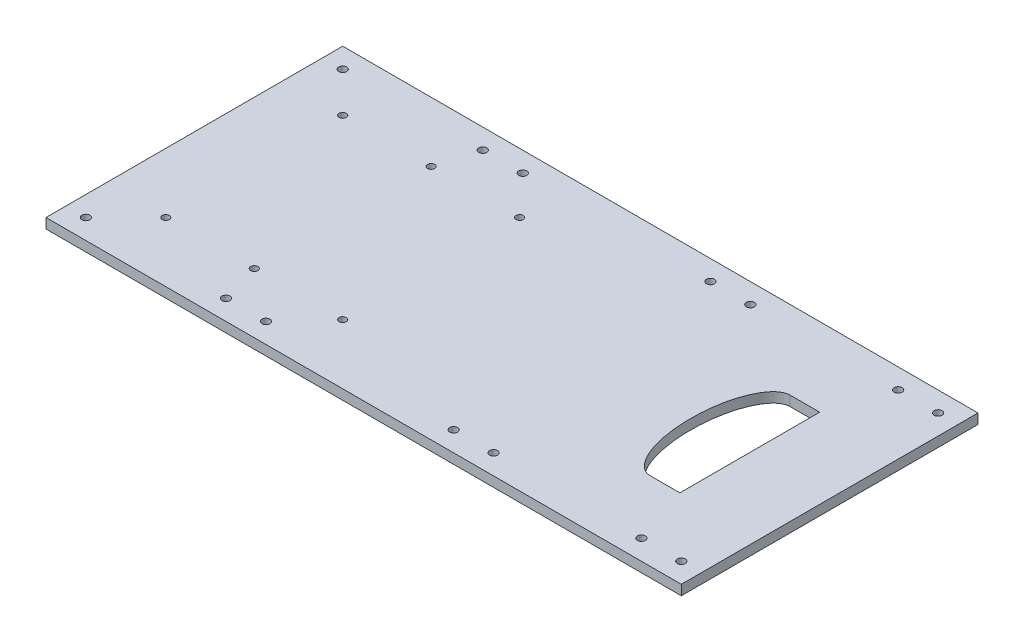
ISO-10303-21;
HEADER;
FILE_DESCRIPTION(('STEP AP214'),'2;1');
FILE_NAME('part.step','',(''),(''),'','','');
FILE_SCHEMA(('AUTOMOTIVE_DESIGN { 1 0 10303 214 1 1 1 1 }'));
ENDSEC;
DATA;
#1=APPLICATION_CONTEXT('core data for automotive mechanical design processes');
#2=APPLICATION_PROTOCOL_DEFINITION('international standard','automotive_design',2000,#1);
#3=PRODUCT_CONTEXT('',#1,'mechanical');
#4=PRODUCT('Part','Part','',(#3));
#5=PRODUCT_RELATED_PRODUCT_CATEGORY('part','',(#4));
#6=PRODUCT_DEFINITION_FORMATION('','',#4);
#7=PRODUCT_DEFINITION_CONTEXT('part definition',#1,'design');
#8=PRODUCT_DEFINITION('design','',#6,#7);
#9=PRODUCT_DEFINITION_SHAPE('','',#8);
#10=(LENGTH_UNIT() NAMED_UNIT(*) SI_UNIT(.MILLI.,.METRE.));
#11=(NAMED_UNIT(*) PLANE_ANGLE_UNIT() SI_UNIT($,.RADIAN.));
#12=(NAMED_UNIT(*) SI_UNIT($,.STERADIAN.) SOLID_ANGLE_UNIT());
#13=UNCERTAINTY_MEASURE_WITH_UNIT(LENGTH_MEASURE(1.E-05),#10,'distance_accuracy_value','');
#14=(GEOMETRIC_REPRESENTATION_CONTEXT(3) GLOBAL_UNCERTAINTY_ASSIGNED_CONTEXT((#13)) GLOBAL_UNIT_ASSIGNED_CONTEXT((#10,
#11,#12)) REPRESENTATION_CONTEXT('',''));
#15=CARTESIAN_POINT('',(0.,0.,0.));
#16=DIRECTION('',(0.,0.,1.));
#17=DIRECTION('',(1.,0.,0.));
#18=AXIS2_PLACEMENT_3D('',#15,#16,#17);
#19=CARTESIAN_POINT('',(286.384454851621,5.,1.06989237388449E-13));
#20=DIRECTION('',(1.,0.,0.));
#21=DIRECTION('',(0.,0.,-1.));
#22=AXIS2_PLACEMENT_3D('',#19,#20,#21);
#23=PLANE('',#22);
#24=DIRECTION('',(0.,0.,1.));
#25=VECTOR('',#24,1.);
#26=CARTESIAN_POINT('',(286.384454851621,0.,1.06989237388449E-13));
#27=LINE('',#26,#25);
#28=CARTESIAN_POINT('',(286.384454851621,0.,2.88781780476488));
#29=VERTEX_POINT('',#28);
#30=CARTESIAN_POINT('',(286.384454851621,0.,151.477817804765));
#31=VERTEX_POINT('',#30);
#32=EDGE_CURVE('E270',#29,#31,#27,.T.);
#33=ORIENTED_EDGE('',*,*,#32,.F.);
#34=DIRECTION('',(0.,-1.,0.));
#35=VECTOR('',#34,1.);
#36=CARTESIAN_POINT('',(286.384454851621,5.,2.88781780476488));
#37=LINE('',#36,#35);
#38=CARTESIAN_POINT('',(286.384454851621,5.,2.88781780476488));
#39=VERTEX_POINT('',#38);
#40=EDGE_CURVE('E12',#39,#29,#37,.T.);
#41=ORIENTED_EDGE('',*,*,#40,.F.);
#42=DIRECTION('',(0.,0.,1.));
#43=VECTOR('',#42,1.);
#44=CARTESIAN_POINT('',(286.384454851621,5.,1.06989237388449E-13));
#45=LINE('',#44,#43);
#46=CARTESIAN_POINT('',(286.384454851621,5.,151.477817804765));
#47=VERTEX_POINT('',#46);
#48=EDGE_CURVE('E280',#39,#47,#45,.T.);
#49=ORIENTED_EDGE('',*,*,#48,.T.);
#50=DIRECTION('',(0.,-1.,0.));
#51=VECTOR('',#50,1.);
#52=CARTESIAN_POINT('',(286.384454851621,5.,151.477817804765));
#53=LINE('',#52,#51);
#54=EDGE_CURVE('E281',#47,#31,#53,.T.);
#55=ORIENTED_EDGE('',*,*,#54,.T.);
#56=EDGE_LOOP('',(#33,#41,#49,#55));
#57=FACE_BOUND('',#56,.T.);
#58=ADVANCED_FACE('F58',(#57),#23,.T.);
#59=CARTESIAN_POINT('',(0.,5.,2.88781780476488));
#60=DIRECTION('',(0.,0.,-1.));
#61=DIRECTION('',(-1.,0.,0.));
#62=AXIS2_PLACEMENT_3D('',#59,#60,#61);
#63=PLANE('',#62);
#64=DIRECTION('',(1.,0.,0.));
#65=VECTOR('',#64,1.);
#66=CARTESIAN_POINT('',(0.,0.,2.88781780476488));
#67=LINE('',#66,#65);
#68=CARTESIAN_POINT('',(-31.7655451483791,0.,2.88781780476488));
#69=VERTEX_POINT('',#68);
#70=EDGE_CURVE('E262',#69,#29,#67,.T.);
#71=ORIENTED_EDGE('',*,*,#70,.F.);
#72=DIRECTION('',(0.,-1.,0.));
#73=VECTOR('',#72,1.);
#74=CARTESIAN_POINT('',(-31.7655451483791,5.,2.88781780476488));
#75=LINE('',#74,#73);
#76=CARTESIAN_POINT('',(-31.7655451483791,5.,2.88781780476488));
#77=VERTEX_POINT('',#76);
#78=EDGE_CURVE('E65',#77,#69,#75,.T.);
#79=ORIENTED_EDGE('',*,*,#78,.F.);
#80=DIRECTION('',(1.,0.,0.));
#81=VECTOR('',#80,1.);
#82=CARTESIAN_POINT('',(0.,5.,2.88781780476488));
#83=LINE('',#82,#81);
#84=EDGE_CURVE('E295',#77,#39,#83,.T.);
#85=ORIENTED_EDGE('',*,*,#84,.T.);
#86=ORIENTED_EDGE('',*,*,#40,.T.);
#87=EDGE_LOOP('',(#71,#79,#85,#86));
#88=FACE_BOUND('',#87,.T.);
#89=ADVANCED_FACE('F252',(#88),#63,.T.);
#90=CARTESIAN_POINT('',(-31.7655451483791,5.,0.));
#91=DIRECTION('',(1.,0.,0.));
#92=DIRECTION('',(0.,0.,-1.));
#93=AXIS2_PLACEMENT_3D('',#90,#91,#92);
#94=PLANE('',#93);
#95=DIRECTION('',(0.,0.,1.));
#96=VECTOR('',#95,1.);
#97=CARTESIAN_POINT('',(-31.7655451483791,0.,0.));
#98=LINE('',#97,#96);
#99=CARTESIAN_POINT('',(-31.7655451483791,0.,151.477817804765));
#100=VERTEX_POINT('',#99);
#101=EDGE_CURVE('E269',#69,#100,#98,.T.);
#102=ORIENTED_EDGE('',*,*,#101,.T.);
#103=DIRECTION('',(0.,-1.,0.));
#104=VECTOR('',#103,1.);
#105=CARTESIAN_POINT('',(-31.7655451483791,5.,151.477817804765));
#106=LINE('',#105,#104);
#107=CARTESIAN_POINT('',(-31.7655451483791,5.,151.477817804765));
#108=VERTEX_POINT('',#107);
#109=EDGE_CURVE('E283',#108,#100,#106,.T.);
#110=ORIENTED_EDGE('',*,*,#109,.F.);
#111=DIRECTION('',(0.,0.,1.));
#112=VECTOR('',#111,1.);
#113=CARTESIAN_POINT('',(-31.7655451483791,5.,0.));
#114=LINE('',#113,#112);
#115=EDGE_CURVE('E287',#77,#108,#114,.T.);
#116=ORIENTED_EDGE('',*,*,#115,.F.);
#117=ORIENTED_EDGE('',*,*,#78,.T.);
#118=EDGE_LOOP('',(#102,#110,#116,#117));
#119=FACE_BOUND('',#118,.T.);
#120=ADVANCED_FACE('F249',(#119),#94,.F.);
#121=CARTESIAN_POINT('',(0.,5.,151.477817804765));
#122=DIRECTION('',(0.,0.,-1.));
#123=DIRECTION('',(-1.,0.,0.));
#124=AXIS2_PLACEMENT_3D('',#121,#122,#123);
#125=PLANE('',#124);
#126=DIRECTION('',(1.,0.,0.));
#127=VECTOR('',#126,1.);
#128=CARTESIAN_POINT('',(0.,0.,151.477817804765));
#129=LINE('',#128,#127);
#130=EDGE_CURVE('E272',#100,#31,#129,.T.);
#131=ORIENTED_EDGE('',*,*,#130,.T.);
#132=ORIENTED_EDGE('',*,*,#54,.F.);
#133=DIRECTION('',(1.,0.,0.));
#134=VECTOR('',#133,1.);
#135=CARTESIAN_POINT('',(0.,5.,151.477817804765));
#136=LINE('',#135,#134);
#137=EDGE_CURVE('E284',#108,#47,#136,.T.);
#138=ORIENTED_EDGE('',*,*,#137,.F.);
#139=ORIENTED_EDGE('',*,*,#109,.T.);
#140=EDGE_LOOP('',(#131,#132,#138,#139));
#141=FACE_BOUND('',#140,.T.);
#142=ADVANCED_FACE('F243',(#141),#125,.F.);
#143=CARTESIAN_POINT('',(0.,5.,0.));
#144=DIRECTION('',(0.,1.,0.));
#145=DIRECTION('',(0.,0.,1.));
#146=AXIS2_PLACEMENT_3D('',#143,#144,#145);
#147=PLANE('',#146);
#148=DIRECTION('',(1.,0.,0.));
#149=VECTOR('',#148,1.);
#150=CARTESIAN_POINT('',(0.,5.,112.182817804765));
#151=LINE('',#150,#149);
#152=CARTESIAN_POINT('',(231.591274663147,5.,112.182817804765));
#153=VERTEX_POINT('',#152);
#154=CARTESIAN_POINT('',(246.384454851621,5.,112.182817804765));
#155=VERTEX_POINT('',#154);
#156=EDGE_CURVE('E124',#153,#155,#151,.T.);
#157=ORIENTED_EDGE('',*,*,#156,.F.);
#158=CARTESIAN_POINT('',(231.591274663147,5.,77.1828178047649));
#159=DIRECTION('',(0.,-1.,0.));
#160=DIRECTION('',(0.,0.,1.));
#161=AXIS2_PLACEMENT_3D('',#158,#159,#160);
#162=ELLIPSE('',#161,35.,14.7931801884737);
#163=CARTESIAN_POINT('',(231.591274663147,5.,42.1828178047649));
#164=VERTEX_POINT('',#163);
#165=EDGE_CURVE('E144',#164,#153,#162,.F.);
#166=ORIENTED_EDGE('',*,*,#165,.F.);
#167=DIRECTION('',(1.,0.,0.));
#168=VECTOR('',#167,1.);
#169=CARTESIAN_POINT('',(0.,5.,42.1828178047648));
#170=LINE('',#169,#168);
#171=CARTESIAN_POINT('',(246.384454851621,5.,42.1828178047649));
#172=VERTEX_POINT('',#171);
#173=EDGE_CURVE('E422',#164,#172,#170,.T.);
#174=ORIENTED_EDGE('',*,*,#173,.T.);
#175=DIRECTION('',(0.,0.,-1.));
#176=VECTOR('',#175,1.);
#177=CARTESIAN_POINT('',(246.384454851621,5.,0.));
#178=LINE('',#177,#176);
#179=EDGE_CURVE('E420',#155,#172,#178,.T.);
#180=ORIENTED_EDGE('',*,*,#179,.F.);
#181=EDGE_LOOP('',(#157,#166,#174,#180));
#182=FACE_BOUND('',#181,.T.);
#183=CARTESIAN_POINT('',(256.384454851621,5.,141.477817804765));
#184=DIRECTION('',(0.,1.,0.));
#185=DIRECTION('',(0.,0.,1.));
#186=AXIS2_PLACEMENT_3D('',#183,#184,#185);
#187=CIRCLE('',#186,2.);
#188=CARTESIAN_POINT('',(256.384454851621,5.,143.477817804765));
#189=VERTEX_POINT('',#188);
#190=EDGE_CURVE('E407',#189,#189,#187,.T.);
#191=ORIENTED_EDGE('',*,*,#190,.F.);
#192=EDGE_LOOP('',(#191));
#193=FACE_BOUND('',#192,.T.);
#194=CARTESIAN_POINT('',(256.384454851621,5.,12.8878178047649));
#195=DIRECTION('',(0.,1.,0.));
#196=DIRECTION('',(0.,0.,1.));
#197=AXIS2_PLACEMENT_3D('',#194,#195,#196);
#198=CIRCLE('',#197,2.);
#199=CARTESIAN_POINT('',(256.384454851621,5.,14.8878178047649));
#200=VERTEX_POINT('',#199);
#201=EDGE_CURVE('E410',#200,#200,#198,.T.);
#202=ORIENTED_EDGE('',*,*,#201,.F.);
#203=EDGE_LOOP('',(#202));
#204=FACE_BOUND('',#203,.T.);
#205=CARTESIAN_POINT('',(48.3844548516209,5.,141.477817804765));
#206=DIRECTION('',(0.,1.,0.));
#207=DIRECTION('',(0.,0.,1.));
#208=AXIS2_PLACEMENT_3D('',#205,#206,#207);
#209=CIRCLE('',#208,2.);
#210=CARTESIAN_POINT('',(48.3844548516209,5.,143.477817804765));
#211=VERTEX_POINT('',#210);
#212=EDGE_CURVE('E357',#211,#211,#209,.T.);
#213=ORIENTED_EDGE('',*,*,#212,.F.);
#214=EDGE_LOOP('',(#213));
#215=FACE_BOUND('',#214,.T.);
#216=CARTESIAN_POINT('',(162.384454851621,5.,141.477817804765));
#217=DIRECTION('',(0.,1.,0.));
#218=DIRECTION('',(0.,0.,1.));
#219=AXIS2_PLACEMENT_3D('',#216,#217,#218);
#220=CIRCLE('',#219,2.);
#221=CARTESIAN_POINT('',(162.384454851621,5.,143.477817804765));
#222=VERTEX_POINT('',#221);
#223=EDGE_CURVE('E362',#222,#222,#220,.T.);
#224=ORIENTED_EDGE('',*,*,#223,.F.);
#225=EDGE_LOOP('',(#224));
#226=FACE_BOUND('',#225,.T.);
#227=CARTESIAN_POINT('',(182.384454851621,5.,141.477817804765));
#228=DIRECTION('',(0.,1.,0.));
#229=DIRECTION('',(0.,0.,1.));
#230=AXIS2_PLACEMENT_3D('',#227,#228,#229);
#231=CIRCLE('',#230,2.);
#232=CARTESIAN_POINT('',(182.384454851621,5.,143.477817804765));
#233=VERTEX_POINT('',#232);
#234=EDGE_CURVE('E365',#233,#233,#231,.T.);
#235=ORIENTED_EDGE('',*,*,#234,.F.);
#236=EDGE_LOOP('',(#235));
#237=FACE_BOUND('',#236,.T.);
#238=CARTESIAN_POINT('',(182.384454851621,5.,12.8878178047649));
#239=DIRECTION('',(0.,1.,0.));
#240=DIRECTION('',(0.,0.,1.));
#241=AXIS2_PLACEMENT_3D('',#238,#239,#240);
#242=CIRCLE('',#241,2.);
#243=CARTESIAN_POINT('',(182.384454851621,5.,14.8878178047649));
#244=VERTEX_POINT('',#243);
#245=EDGE_CURVE('E368',#244,#244,#242,.T.);
#246=ORIENTED_EDGE('',*,*,#245,.F.);
#247=EDGE_LOOP('',(#246));
#248=FACE_BOUND('',#247,.T.);
#249=CARTESIAN_POINT('',(68.384454851621,5.,12.8878178047649));
#250=DIRECTION('',(0.,1.,0.));
#251=DIRECTION('',(0.,0.,1.));
#252=AXIS2_PLACEMENT_3D('',#249,#250,#251);
#253=CIRCLE('',#252,2.);
#254=CARTESIAN_POINT('',(68.384454851621,5.,14.8878178047649));
#255=VERTEX_POINT('',#254);
#256=EDGE_CURVE('E371',#255,#255,#253,.T.);
#257=ORIENTED_EDGE('',*,*,#256,.F.);
#258=EDGE_LOOP('',(#257));
#259=FACE_BOUND('',#258,.T.);
#260=CARTESIAN_POINT('',(48.3844548516209,5.,12.8878178047649));
#261=DIRECTION('',(0.,1.,0.));
#262=DIRECTION('',(0.,0.,1.));
#263=AXIS2_PLACEMENT_3D('',#260,#261,#262);
#264=CIRCLE('',#263,2.);
#265=CARTESIAN_POINT('',(48.3844548516209,5.,14.8878178047649));
#266=VERTEX_POINT('',#265);
#267=EDGE_CURVE('E374',#266,#266,#264,.T.);
#268=ORIENTED_EDGE('',*,*,#267,.F.);
#269=EDGE_LOOP('',(#268));
#270=FACE_BOUND('',#269,.T.);
#271=CARTESIAN_POINT('',(162.384454851621,5.,12.8878178047649));
#272=DIRECTION('',(0.,1.,0.));
#273=DIRECTION('',(0.,0.,1.));
#274=AXIS2_PLACEMENT_3D('',#271,#272,#273);
#275=CIRCLE('',#274,2.);
#276=CARTESIAN_POINT('',(162.384454851621,5.,14.8878178047649));
#277=VERTEX_POINT('',#276);
#278=EDGE_CURVE('E377',#277,#277,#275,.T.);
#279=ORIENTED_EDGE('',*,*,#278,.F.);
#280=EDGE_LOOP('',(#279));
#281=FACE_BOUND('',#280,.T.);
#282=CARTESIAN_POINT('',(68.384454851621,5.,141.477817804765));
#283=DIRECTION('',(0.,1.,0.));
#284=DIRECTION('',(0.,0.,1.));
#285=AXIS2_PLACEMENT_3D('',#282,#283,#284);
#286=CIRCLE('',#285,2.);
#287=CARTESIAN_POINT('',(68.384454851621,5.,143.477817804765));
#288=VERTEX_POINT('',#287);
#289=EDGE_CURVE('E380',#288,#288,#286,.T.);
#290=ORIENTED_EDGE('',*,*,#289,.F.);
#291=EDGE_LOOP('',(#290));
#292=FACE_BOUND('',#291,.T.);
#293=CARTESIAN_POINT('',(86.8244548516209,5.,121.477817804765));
#294=DIRECTION('',(0.,-1.,0.));
#295=DIRECTION('',(0.,0.,-1.));
#296=AXIS2_PLACEMENT_3D('',#293,#294,#295);
#297=CIRCLE('',#296,1.79999999999999);
#298=CARTESIAN_POINT('',(86.8244548516209,5.,119.677817804765));
#299=VERTEX_POINT('',#298);
#300=EDGE_CURVE('E349',#299,#299,#297,.T.);
#301=ORIENTED_EDGE('',*,*,#300,.T.);
#302=EDGE_LOOP('',(#301));
#303=FACE_BOUND('',#302,.T.);
#304=CARTESIAN_POINT('',(86.8244548516209,5.,32.8878178047649));
#305=DIRECTION('',(0.,-1.,0.));
#306=DIRECTION('',(0.,0.,-1.));
#307=AXIS2_PLACEMENT_3D('',#304,#305,#306);
#308=CIRCLE('',#307,1.79999999999999);
#309=CARTESIAN_POINT('',(86.8244548516209,5.,31.0878178047649));
#310=VERTEX_POINT('',#309);
#311=EDGE_CURVE('E343',#310,#310,#308,.T.);
#312=ORIENTED_EDGE('',*,*,#311,.T.);
#313=EDGE_LOOP('',(#312));
#314=FACE_BOUND('',#313,.T.);
#315=CARTESIAN_POINT('',(42.5294548516209,5.,32.8878178047649));
#316=DIRECTION('',(0.,-1.,0.));
#317=DIRECTION('',(0.,0.,-1.));
#318=AXIS2_PLACEMENT_3D('',#315,#316,#317);
#319=CIRCLE('',#318,1.8);
#320=CARTESIAN_POINT('',(42.5294548516209,5.,31.0878178047649));
#321=VERTEX_POINT('',#320);
#322=EDGE_CURVE('E337',#321,#321,#319,.T.);
#323=ORIENTED_EDGE('',*,*,#322,.T.);
#324=EDGE_LOOP('',(#323));
#325=FACE_BOUND('',#324,.T.);
#326=CARTESIAN_POINT('',(-1.76554514837908,5.,32.8878178047649));
#327=DIRECTION('',(0.,-1.,0.));
#328=DIRECTION('',(0.,0.,-1.));
#329=AXIS2_PLACEMENT_3D('',#326,#327,#328);
#330=CIRCLE('',#329,1.8);
#331=CARTESIAN_POINT('',(-1.76554514837908,5.,31.0878178047649));
#332=VERTEX_POINT('',#331);
#333=EDGE_CURVE('E330',#332,#332,#330,.T.);
#334=ORIENTED_EDGE('',*,*,#333,.T.);
#335=EDGE_LOOP('',(#334));
#336=FACE_BOUND('',#335,.T.);
#337=CARTESIAN_POINT('',(-1.76554514837908,5.,121.477817804765));
#338=DIRECTION('',(0.,-1.,0.));
#339=DIRECTION('',(0.,0.,-1.));
#340=AXIS2_PLACEMENT_3D('',#337,#338,#339);
#341=CIRCLE('',#340,1.8);
#342=CARTESIAN_POINT('',(-1.76554514837908,5.,119.677817804765));
#343=VERTEX_POINT('',#342);
#344=EDGE_CURVE('E354',#343,#343,#341,.T.);
#345=ORIENTED_EDGE('',*,*,#344,.T.);
#346=EDGE_LOOP('',(#345));
#347=FACE_BOUND('',#346,.T.);
#348=CARTESIAN_POINT('',(42.5294548516209,5.,121.477817804765));
#349=DIRECTION('',(0.,-1.,0.));
#350=DIRECTION('',(0.,0.,-1.));
#351=AXIS2_PLACEMENT_3D('',#348,#349,#350);
#352=CIRCLE('',#351,1.8);
#353=CARTESIAN_POINT('',(42.5294548516209,5.,119.677817804765));
#354=VERTEX_POINT('',#353);
#355=EDGE_CURVE('E310',#354,#354,#352,.T.);
#356=ORIENTED_EDGE('',*,*,#355,.T.);
#357=EDGE_LOOP('',(#356));
#358=FACE_BOUND('',#357,.T.);
#359=CARTESIAN_POINT('',(276.384454851621,5.,141.477817804765));
#360=DIRECTION('',(0.,1.,0.));
#361=DIRECTION('',(0.,0.,1.));
#362=AXIS2_PLACEMENT_3D('',#359,#360,#361);
#363=CIRCLE('',#362,2.);
#364=CARTESIAN_POINT('',(276.384454851621,5.,143.477817804765));
#365=VERTEX_POINT('',#364);
#366=EDGE_CURVE('E306',#365,#365,#363,.T.);
#367=ORIENTED_EDGE('',*,*,#366,.F.);
#368=EDGE_LOOP('',(#367));
#369=FACE_BOUND('',#368,.T.);
#370=CARTESIAN_POINT('',(276.384454851621,5.,12.8878178047649));
#371=DIRECTION('',(0.,1.,0.));
#372=DIRECTION('',(0.,0.,1.));
#373=AXIS2_PLACEMENT_3D('',#370,#371,#372);
#374=CIRCLE('',#373,2.);
#375=CARTESIAN_POINT('',(276.384454851621,5.,14.8878178047649));
#376=VERTEX_POINT('',#375);
#377=EDGE_CURVE('E313',#376,#376,#374,.T.);
#378=ORIENTED_EDGE('',*,*,#377,.F.);
#379=EDGE_LOOP('',(#378));
#380=FACE_BOUND('',#379,.T.);
#381=CARTESIAN_POINT('',(-21.7655451483791,5.,12.8878178047649));
#382=DIRECTION('',(0.,1.,0.));
#383=DIRECTION('',(0.,0.,1.));
#384=AXIS2_PLACEMENT_3D('',#381,#382,#383);
#385=CIRCLE('',#384,2.);
#386=CARTESIAN_POINT('',(-21.7655451483791,5.,14.8878178047649));
#387=VERTEX_POINT('',#386);
#388=EDGE_CURVE('E319',#387,#387,#385,.T.);
#389=ORIENTED_EDGE('',*,*,#388,.F.);
#390=EDGE_LOOP('',(#389));
#391=FACE_BOUND('',#390,.T.);
#392=CARTESIAN_POINT('',(-21.7655451483791,5.,141.477817804765));
#393=DIRECTION('',(0.,1.,0.));
#394=DIRECTION('',(0.,0.,1.));
#395=AXIS2_PLACEMENT_3D('',#392,#393,#394);
#396=CIRCLE('',#395,2.);
#397=CARTESIAN_POINT('',(-21.7655451483791,5.,143.477817804765));
#398=VERTEX_POINT('',#397);
#399=EDGE_CURVE('E300',#398,#398,#396,.T.);
#400=ORIENTED_EDGE('',*,*,#399,.F.);
#401=EDGE_LOOP('',(#400));
#402=FACE_BOUND('',#401,.T.);
#403=ORIENTED_EDGE('',*,*,#48,.F.);
#404=ORIENTED_EDGE('',*,*,#84,.F.);
#405=ORIENTED_EDGE('',*,*,#115,.T.);
#406=ORIENTED_EDGE('',*,*,#137,.T.);
#407=EDGE_LOOP('',(#403,#404,#405,#406));
#408=FACE_BOUND('',#407,.T.);
#409=ADVANCED_FACE('F240',(#182,#193,#204,#215,#226,#237,#248,#259,#270,#281,#292,#303,#314,
#325,#336,#347,#358,#369,#380,#391,#402,#408),#147,.T.);
#410=CARTESIAN_POINT('',(0.,0.,0.));
#411=DIRECTION('',(0.,1.,0.));
#412=DIRECTION('',(0.,0.,1.));
#413=AXIS2_PLACEMENT_3D('',#410,#411,#412);
#414=PLANE('',#413);
#415=CARTESIAN_POINT('',(231.591274663147,0.,77.1828178047649));
#416=DIRECTION('',(0.,-1.,0.));
#417=DIRECTION('',(0.,0.,1.));
#418=AXIS2_PLACEMENT_3D('',#415,#416,#417);
#419=ELLIPSE('',#418,35.,14.7931801884737);
#420=CARTESIAN_POINT('',(231.591274663147,0.,112.182817804765));
#421=VERTEX_POINT('',#420);
#422=CARTESIAN_POINT('',(231.591274663147,0.,42.1828178047649));
#423=VERTEX_POINT('',#422);
#424=EDGE_CURVE('E141',#421,#423,#419,.T.);
#425=ORIENTED_EDGE('',*,*,#424,.F.);
#426=DIRECTION('',(-1.,0.,0.));
#427=VECTOR('',#426,1.);
#428=CARTESIAN_POINT('',(0.,0.,112.182817804765));
#429=LINE('',#428,#427);
#430=CARTESIAN_POINT('',(246.384454851621,0.,112.182817804765));
#431=VERTEX_POINT('',#430);
#432=EDGE_CURVE('E80',#431,#421,#429,.T.);
#433=ORIENTED_EDGE('',*,*,#432,.F.);
#434=DIRECTION('',(0.,0.,1.));
#435=VECTOR('',#434,1.);
#436=CARTESIAN_POINT('',(246.384454851621,0.,0.));
#437=LINE('',#436,#435);
#438=CARTESIAN_POINT('',(246.384454851621,0.,42.1828178047649));
#439=VERTEX_POINT('',#438);
#440=EDGE_CURVE('E130',#439,#431,#437,.T.);
#441=ORIENTED_EDGE('',*,*,#440,.F.);
#442=DIRECTION('',(-1.,0.,0.));
#443=VECTOR('',#442,1.);
#444=CARTESIAN_POINT('',(0.,0.,42.1828178047648));
#445=LINE('',#444,#443);
#446=EDGE_CURVE('E146',#439,#423,#445,.T.);
#447=ORIENTED_EDGE('',*,*,#446,.T.);
#448=EDGE_LOOP('',(#425,#433,#441,#447));
#449=FACE_BOUND('',#448,.T.);
#450=CARTESIAN_POINT('',(256.384454851621,0.,141.477817804765));
#451=DIRECTION('',(0.,-1.,0.));
#452=DIRECTION('',(0.,0.,-1.));
#453=AXIS2_PLACEMENT_3D('',#450,#451,#452);
#454=CIRCLE('',#453,2.);
#455=CARTESIAN_POINT('',(256.384454851621,0.,139.477817804765));
#456=VERTEX_POINT('',#455);
#457=EDGE_CURVE('E413',#456,#456,#454,.T.);
#458=ORIENTED_EDGE('',*,*,#457,.F.);
#459=EDGE_LOOP('',(#458));
#460=FACE_BOUND('',#459,.T.);
#461=CARTESIAN_POINT('',(256.384454851621,0.,12.8878178047649));
#462=DIRECTION('',(0.,-1.,0.));
#463=DIRECTION('',(0.,0.,-1.));
#464=AXIS2_PLACEMENT_3D('',#461,#462,#463);
#465=CIRCLE('',#464,2.);
#466=CARTESIAN_POINT('',(256.384454851621,0.,10.8878178047649));
#467=VERTEX_POINT('',#466);
#468=EDGE_CURVE('E414',#467,#467,#465,.T.);
#469=ORIENTED_EDGE('',*,*,#468,.F.);
#470=EDGE_LOOP('',(#469));
#471=FACE_BOUND('',#470,.T.);
#472=CARTESIAN_POINT('',(48.3844548516209,0.,141.477817804765));
#473=DIRECTION('',(0.,-1.,0.));
#474=DIRECTION('',(0.,0.,-1.));
#475=AXIS2_PLACEMENT_3D('',#472,#473,#474);
#476=CIRCLE('',#475,2.);
#477=CARTESIAN_POINT('',(48.3844548516209,0.,139.477817804765));
#478=VERTEX_POINT('',#477);
#479=EDGE_CURVE('E386',#478,#478,#476,.T.);
#480=ORIENTED_EDGE('',*,*,#479,.F.);
#481=EDGE_LOOP('',(#480));
#482=FACE_BOUND('',#481,.T.);
#483=CARTESIAN_POINT('',(162.384454851621,0.,141.477817804765));
#484=DIRECTION('',(0.,-1.,0.));
#485=DIRECTION('',(0.,0.,-1.));
#486=AXIS2_PLACEMENT_3D('',#483,#484,#485);
#487=CIRCLE('',#486,2.);
#488=CARTESIAN_POINT('',(162.384454851621,0.,139.477817804765));
#489=VERTEX_POINT('',#488);
#490=EDGE_CURVE('E394',#489,#489,#487,.T.);
#491=ORIENTED_EDGE('',*,*,#490,.F.);
#492=EDGE_LOOP('',(#491));
#493=FACE_BOUND('',#492,.T.);
#494=CARTESIAN_POINT('',(182.384454851621,0.,141.477817804765));
#495=DIRECTION('',(0.,-1.,0.));
#496=DIRECTION('',(0.,0.,-1.));
#497=AXIS2_PLACEMENT_3D('',#494,#495,#496);
#498=CIRCLE('',#497,2.);
#499=CARTESIAN_POINT('',(182.384454851621,0.,139.477817804765));
#500=VERTEX_POINT('',#499);
#501=EDGE_CURVE('E390',#500,#500,#498,.T.);
#502=ORIENTED_EDGE('',*,*,#501,.F.);
#503=EDGE_LOOP('',(#502));
#504=FACE_BOUND('',#503,.T.);
#505=CARTESIAN_POINT('',(182.384454851621,0.,12.8878178047649));
#506=DIRECTION('',(0.,-1.,0.));
#507=DIRECTION('',(0.,0.,-1.));
#508=AXIS2_PLACEMENT_3D('',#505,#506,#507);
#509=CIRCLE('',#508,2.);
#510=CARTESIAN_POINT('',(182.384454851621,0.,10.8878178047649));
#511=VERTEX_POINT('',#510);
#512=EDGE_CURVE('E387',#511,#511,#509,.T.);
#513=ORIENTED_EDGE('',*,*,#512,.F.);
#514=EDGE_LOOP('',(#513));
#515=FACE_BOUND('',#514,.T.);
#516=CARTESIAN_POINT('',(68.384454851621,0.,12.8878178047649));
#517=DIRECTION('',(0.,-1.,0.));
#518=DIRECTION('',(0.,0.,-1.));
#519=AXIS2_PLACEMENT_3D('',#516,#517,#518);
#520=CIRCLE('',#519,2.);
#521=CARTESIAN_POINT('',(68.384454851621,0.,10.8878178047649));
#522=VERTEX_POINT('',#521);
#523=EDGE_CURVE('E402',#522,#522,#520,.T.);
#524=ORIENTED_EDGE('',*,*,#523,.F.);
#525=EDGE_LOOP('',(#524));
#526=FACE_BOUND('',#525,.T.);
#527=CARTESIAN_POINT('',(48.3844548516209,0.,12.8878178047649));
#528=DIRECTION('',(0.,-1.,0.));
#529=DIRECTION('',(0.,0.,-1.));
#530=AXIS2_PLACEMENT_3D('',#527,#528,#529);
#531=CIRCLE('',#530,2.);
#532=CARTESIAN_POINT('',(48.3844548516209,0.,10.8878178047649));
#533=VERTEX_POINT('',#532);
#534=EDGE_CURVE('E399',#533,#533,#531,.T.);
#535=ORIENTED_EDGE('',*,*,#534,.F.);
#536=EDGE_LOOP('',(#535));
#537=FACE_BOUND('',#536,.T.);
#538=CARTESIAN_POINT('',(162.384454851621,0.,12.8878178047649));
#539=DIRECTION('',(0.,-1.,0.));
#540=DIRECTION('',(0.,0.,-1.));
#541=AXIS2_PLACEMENT_3D('',#538,#539,#540);
#542=CIRCLE('',#541,2.);
#543=CARTESIAN_POINT('',(162.384454851621,0.,10.8878178047649));
#544=VERTEX_POINT('',#543);
#545=EDGE_CURVE('E391',#544,#544,#542,.T.);
#546=ORIENTED_EDGE('',*,*,#545,.F.);
#547=EDGE_LOOP('',(#546));
#548=FACE_BOUND('',#547,.T.);
#549=CARTESIAN_POINT('',(68.384454851621,0.,141.477817804765));
#550=DIRECTION('',(0.,-1.,0.));
#551=DIRECTION('',(0.,0.,-1.));
#552=AXIS2_PLACEMENT_3D('',#549,#550,#551);
#553=CIRCLE('',#552,2.);
#554=CARTESIAN_POINT('',(68.384454851621,0.,139.477817804765));
#555=VERTEX_POINT('',#554);
#556=EDGE_CURVE('E383',#555,#555,#553,.T.);
#557=ORIENTED_EDGE('',*,*,#556,.F.);
#558=EDGE_LOOP('',(#557));
#559=FACE_BOUND('',#558,.T.);
#560=CARTESIAN_POINT('',(86.8244548516209,0.,121.477817804765));
#561=DIRECTION('',(0.,-1.,0.));
#562=DIRECTION('',(0.,0.,-1.));
#563=AXIS2_PLACEMENT_3D('',#560,#561,#562);
#564=CIRCLE('',#563,1.79999999999999);
#565=CARTESIAN_POINT('',(86.8244548516209,0.,119.677817804765));
#566=VERTEX_POINT('',#565);
#567=EDGE_CURVE('E327',#566,#566,#564,.T.);
#568=ORIENTED_EDGE('',*,*,#567,.F.);
#569=EDGE_LOOP('',(#568));
#570=FACE_BOUND('',#569,.T.);
#571=CARTESIAN_POINT('',(86.8244548516209,0.,32.8878178047649));
#572=DIRECTION('',(0.,-1.,0.));
#573=DIRECTION('',(0.,0.,-1.));
#574=AXIS2_PLACEMENT_3D('',#571,#572,#573);
#575=CIRCLE('',#574,1.79999999999999);
#576=CARTESIAN_POINT('',(86.8244548516209,0.,31.0878178047649));
#577=VERTEX_POINT('',#576);
#578=EDGE_CURVE('E346',#577,#577,#575,.T.);
#579=ORIENTED_EDGE('',*,*,#578,.F.);
#580=EDGE_LOOP('',(#579));
#581=FACE_BOUND('',#580,.T.);
#582=CARTESIAN_POINT('',(42.5294548516209,0.,32.8878178047649));
#583=DIRECTION('',(0.,-1.,0.));
#584=DIRECTION('',(0.,0.,-1.));
#585=AXIS2_PLACEMENT_3D('',#582,#583,#584);
#586=CIRCLE('',#585,1.8);
#587=CARTESIAN_POINT('',(42.5294548516209,0.,31.0878178047649));
#588=VERTEX_POINT('',#587);
#589=EDGE_CURVE('E340',#588,#588,#586,.T.);
#590=ORIENTED_EDGE('',*,*,#589,.F.);
#591=EDGE_LOOP('',(#590));
#592=FACE_BOUND('',#591,.T.);
#593=CARTESIAN_POINT('',(-1.76554514837908,0.,32.8878178047649));
#594=DIRECTION('',(0.,-1.,0.));
#595=DIRECTION('',(0.,0.,-1.));
#596=AXIS2_PLACEMENT_3D('',#593,#594,#595);
#597=CIRCLE('',#596,1.8);
#598=CARTESIAN_POINT('',(-1.76554514837908,0.,31.0878178047649));
#599=VERTEX_POINT('',#598);
#600=EDGE_CURVE('E333',#599,#599,#597,.T.);
#601=ORIENTED_EDGE('',*,*,#600,.F.);
#602=EDGE_LOOP('',(#601));
#603=FACE_BOUND('',#602,.T.);
#604=CARTESIAN_POINT('',(-1.76554514837908,0.,121.477817804765));
#605=DIRECTION('',(0.,-1.,0.));
#606=DIRECTION('',(0.,0.,-1.));
#607=AXIS2_PLACEMENT_3D('',#604,#605,#606);
#608=CIRCLE('',#607,1.8);
#609=CARTESIAN_POINT('',(-1.76554514837908,0.,119.677817804765));
#610=VERTEX_POINT('',#609);
#611=EDGE_CURVE('E334',#610,#610,#608,.T.);
#612=ORIENTED_EDGE('',*,*,#611,.F.);
#613=EDGE_LOOP('',(#612));
#614=FACE_BOUND('',#613,.T.);
#615=CARTESIAN_POINT('',(42.5294548516209,0.,121.477817804765));
#616=DIRECTION('',(0.,-1.,0.));
#617=DIRECTION('',(0.,0.,-1.));
#618=AXIS2_PLACEMENT_3D('',#615,#616,#617);
#619=CIRCLE('',#618,1.8);
#620=CARTESIAN_POINT('',(42.5294548516209,0.,119.677817804765));
#621=VERTEX_POINT('',#620);
#622=EDGE_CURVE('E324',#621,#621,#619,.T.);
#623=ORIENTED_EDGE('',*,*,#622,.F.);
#624=EDGE_LOOP('',(#623));
#625=FACE_BOUND('',#624,.T.);
#626=CARTESIAN_POINT('',(276.384454851621,0.,141.477817804765));
#627=DIRECTION('',(0.,1.,0.));
#628=DIRECTION('',(0.,0.,1.));
#629=AXIS2_PLACEMENT_3D('',#626,#627,#628);
#630=CIRCLE('',#629,2.);
#631=CARTESIAN_POINT('',(276.384454851621,0.,143.477817804765));
#632=VERTEX_POINT('',#631);
#633=EDGE_CURVE('E309',#632,#632,#630,.T.);
#634=ORIENTED_EDGE('',*,*,#633,.T.);
#635=EDGE_LOOP('',(#634));
#636=FACE_BOUND('',#635,.T.);
#637=CARTESIAN_POINT('',(276.384454851621,0.,12.8878178047649));
#638=DIRECTION('',(0.,1.,0.));
#639=DIRECTION('',(0.,0.,1.));
#640=AXIS2_PLACEMENT_3D('',#637,#638,#639);
#641=CIRCLE('',#640,2.);
#642=CARTESIAN_POINT('',(276.384454851621,0.,14.8878178047649));
#643=VERTEX_POINT('',#642);
#644=EDGE_CURVE('E316',#643,#643,#641,.T.);
#645=ORIENTED_EDGE('',*,*,#644,.T.);
#646=EDGE_LOOP('',(#645));
#647=FACE_BOUND('',#646,.T.);
#648=CARTESIAN_POINT('',(-21.7655451483791,0.,12.8878178047649));
#649=DIRECTION('',(0.,1.,0.));
#650=DIRECTION('',(0.,0.,1.));
#651=AXIS2_PLACEMENT_3D('',#648,#649,#650);
#652=CIRCLE('',#651,2.);
#653=CARTESIAN_POINT('',(-21.7655451483791,0.,14.8878178047649));
#654=VERTEX_POINT('',#653);
#655=EDGE_CURVE('E303',#654,#654,#652,.T.);
#656=ORIENTED_EDGE('',*,*,#655,.T.);
#657=EDGE_LOOP('',(#656));
#658=FACE_BOUND('',#657,.T.);
#659=CARTESIAN_POINT('',(-21.7655451483791,0.,141.477817804765));
#660=DIRECTION('',(0.,1.,0.));
#661=DIRECTION('',(0.,0.,1.));
#662=AXIS2_PLACEMENT_3D('',#659,#660,#661);
#663=CIRCLE('',#662,2.);
#664=CARTESIAN_POINT('',(-21.7655451483791,0.,143.477817804765));
#665=VERTEX_POINT('',#664);
#666=EDGE_CURVE('E274',#665,#665,#663,.T.);
#667=ORIENTED_EDGE('',*,*,#666,.T.);
#668=EDGE_LOOP('',(#667));
#669=FACE_BOUND('',#668,.T.);
#670=ORIENTED_EDGE('',*,*,#32,.T.);
#671=ORIENTED_EDGE('',*,*,#130,.F.);
#672=ORIENTED_EDGE('',*,*,#101,.F.);
#673=ORIENTED_EDGE('',*,*,#70,.T.);
#674=EDGE_LOOP('',(#670,#671,#672,#673));
#675=FACE_BOUND('',#674,.T.);
#676=ADVANCED_FACE('F139',(#449,#460,#471,#482,#493,#504,#515,#526,#537,#548,#559,#570,#581,
#592,#603,#614,#625,#636,#647,#658,#669,#675),#414,.F.);
#677=CARTESIAN_POINT('',(-21.7655451483791,0.,141.477817804765));
#678=DIRECTION('',(0.,1.,0.));
#679=DIRECTION('',(0.,0.,1.));
#680=AXIS2_PLACEMENT_3D('',#677,#678,#679);
#681=CYLINDRICAL_SURFACE('',#680,2.);
#682=ORIENTED_EDGE('',*,*,#666,.F.);
#683=EDGE_LOOP('',(#682));
#684=FACE_BOUND('',#683,.T.);
#685=ORIENTED_EDGE('',*,*,#399,.T.);
#686=EDGE_LOOP('',(#685));
#687=FACE_BOUND('',#686,.T.);
#688=ADVANCED_FACE('F229',(#684,#687),#681,.F.);
#689=CARTESIAN_POINT('',(-21.7655451483791,0.,12.8878178047649));
#690=DIRECTION('',(0.,1.,0.));
#691=DIRECTION('',(0.,0.,1.));
#692=AXIS2_PLACEMENT_3D('',#689,#690,#691);
#693=CYLINDRICAL_SURFACE('',#692,2.);
#694=ORIENTED_EDGE('',*,*,#655,.F.);
#695=EDGE_LOOP('',(#694));
#696=FACE_BOUND('',#695,.T.);
#697=ORIENTED_EDGE('',*,*,#388,.T.);
#698=EDGE_LOOP('',(#697));
#699=FACE_BOUND('',#698,.T.);
#700=ADVANCED_FACE('F225',(#696,#699),#693,.F.);
#701=CARTESIAN_POINT('',(276.384454851621,0.,12.8878178047649));
#702=DIRECTION('',(0.,1.,0.));
#703=DIRECTION('',(0.,0.,1.));
#704=AXIS2_PLACEMENT_3D('',#701,#702,#703);
#705=CYLINDRICAL_SURFACE('',#704,2.);
#706=ORIENTED_EDGE('',*,*,#644,.F.);
#707=EDGE_LOOP('',(#706));
#708=FACE_BOUND('',#707,.T.);
#709=ORIENTED_EDGE('',*,*,#377,.T.);
#710=EDGE_LOOP('',(#709));
#711=FACE_BOUND('',#710,.T.);
#712=ADVANCED_FACE('F228',(#708,#711),#705,.F.);
#713=CARTESIAN_POINT('',(276.384454851621,0.,141.477817804765));
#714=DIRECTION('',(0.,1.,0.));
#715=DIRECTION('',(0.,0.,1.));
#716=AXIS2_PLACEMENT_3D('',#713,#714,#715);
#717=CYLINDRICAL_SURFACE('',#716,2.);
#718=ORIENTED_EDGE('',*,*,#633,.F.);
#719=EDGE_LOOP('',(#718));
#720=FACE_BOUND('',#719,.T.);
#721=ORIENTED_EDGE('',*,*,#366,.T.);
#722=EDGE_LOOP('',(#721));
#723=FACE_BOUND('',#722,.T.);
#724=ADVANCED_FACE('F223',(#720,#723),#717,.F.);
#725=CARTESIAN_POINT('',(42.5294548516209,5.,121.477817804765));
#726=DIRECTION('',(0.,-1.,0.));
#727=DIRECTION('',(0.,0.,-1.));
#728=AXIS2_PLACEMENT_3D('',#725,#726,#727);
#729=CYLINDRICAL_SURFACE('',#728,1.8);
#730=ORIENTED_EDGE('',*,*,#355,.F.);
#731=EDGE_LOOP('',(#730));
#732=FACE_BOUND('',#731,.T.);
#733=ORIENTED_EDGE('',*,*,#622,.T.);
#734=EDGE_LOOP('',(#733));
#735=FACE_BOUND('',#734,.T.);
#736=ADVANCED_FACE('F205',(#732,#735),#729,.F.);
#737=CARTESIAN_POINT('',(-1.76554514837908,5.,121.477817804765));
#738=DIRECTION('',(0.,-1.,0.));
#739=DIRECTION('',(0.,0.,-1.));
#740=AXIS2_PLACEMENT_3D('',#737,#738,#739);
#741=CYLINDRICAL_SURFACE('',#740,1.8);
#742=ORIENTED_EDGE('',*,*,#344,.F.);
#743=EDGE_LOOP('',(#742));
#744=FACE_BOUND('',#743,.T.);
#745=ORIENTED_EDGE('',*,*,#611,.T.);
#746=EDGE_LOOP('',(#745));
#747=FACE_BOUND('',#746,.T.);
#748=ADVANCED_FACE('F201',(#744,#747),#741,.F.);
#749=CARTESIAN_POINT('',(-1.76554514837908,5.,32.8878178047649));
#750=DIRECTION('',(0.,-1.,0.));
#751=DIRECTION('',(0.,0.,-1.));
#752=AXIS2_PLACEMENT_3D('',#749,#750,#751);
#753=CYLINDRICAL_SURFACE('',#752,1.8);
#754=ORIENTED_EDGE('',*,*,#333,.F.);
#755=EDGE_LOOP('',(#754));
#756=FACE_BOUND('',#755,.T.);
#757=ORIENTED_EDGE('',*,*,#600,.T.);
#758=EDGE_LOOP('',(#757));
#759=FACE_BOUND('',#758,.T.);
#760=ADVANCED_FACE('F204',(#756,#759),#753,.F.);
#761=CARTESIAN_POINT('',(42.5294548516209,5.,32.8878178047649));
#762=DIRECTION('',(0.,-1.,0.));
#763=DIRECTION('',(0.,0.,-1.));
#764=AXIS2_PLACEMENT_3D('',#761,#762,#763);
#765=CYLINDRICAL_SURFACE('',#764,1.8);
#766=ORIENTED_EDGE('',*,*,#322,.F.);
#767=EDGE_LOOP('',(#766));
#768=FACE_BOUND('',#767,.T.);
#769=ORIENTED_EDGE('',*,*,#589,.T.);
#770=EDGE_LOOP('',(#769));
#771=FACE_BOUND('',#770,.T.);
#772=ADVANCED_FACE('F213',(#768,#771),#765,.F.);
#773=CARTESIAN_POINT('',(86.8244548516209,5.,32.8878178047649));
#774=DIRECTION('',(0.,-1.,0.));
#775=DIRECTION('',(0.,0.,-1.));
#776=AXIS2_PLACEMENT_3D('',#773,#774,#775);
#777=CYLINDRICAL_SURFACE('',#776,1.79999999999999);
#778=ORIENTED_EDGE('',*,*,#311,.F.);
#779=EDGE_LOOP('',(#778));
#780=FACE_BOUND('',#779,.T.);
#781=ORIENTED_EDGE('',*,*,#578,.T.);
#782=EDGE_LOOP('',(#781));
#783=FACE_BOUND('',#782,.T.);
#784=ADVANCED_FACE('F209',(#780,#783),#777,.F.);
#785=CARTESIAN_POINT('',(86.8244548516209,5.,121.477817804765));
#786=DIRECTION('',(0.,-1.,0.));
#787=DIRECTION('',(0.,0.,-1.));
#788=AXIS2_PLACEMENT_3D('',#785,#786,#787);
#789=CYLINDRICAL_SURFACE('',#788,1.79999999999999);
#790=ORIENTED_EDGE('',*,*,#300,.F.);
#791=EDGE_LOOP('',(#790));
#792=FACE_BOUND('',#791,.T.);
#793=ORIENTED_EDGE('',*,*,#567,.T.);
#794=EDGE_LOOP('',(#793));
#795=FACE_BOUND('',#794,.T.);
#796=ADVANCED_FACE('F199',(#792,#795),#789,.F.);
#797=CARTESIAN_POINT('',(68.384454851621,10.,141.477817804765));
#798=DIRECTION('',(0.,-1.,0.));
#799=DIRECTION('',(0.,0.,-1.));
#800=AXIS2_PLACEMENT_3D('',#797,#798,#799);
#801=CYLINDRICAL_SURFACE('',#800,2.);
#802=ORIENTED_EDGE('',*,*,#289,.T.);
#803=EDGE_LOOP('',(#802));
#804=FACE_BOUND('',#803,.T.);
#805=ORIENTED_EDGE('',*,*,#556,.T.);
#806=EDGE_LOOP('',(#805));
#807=FACE_BOUND('',#806,.T.);
#808=ADVANCED_FACE('F178',(#804,#807),#801,.F.);
#809=CARTESIAN_POINT('',(162.384454851621,10.,12.8878178047649));
#810=DIRECTION('',(0.,-1.,0.));
#811=DIRECTION('',(0.,0.,-1.));
#812=AXIS2_PLACEMENT_3D('',#809,#810,#811);
#813=CYLINDRICAL_SURFACE('',#812,2.);
#814=ORIENTED_EDGE('',*,*,#278,.T.);
#815=EDGE_LOOP('',(#814));
#816=FACE_BOUND('',#815,.T.);
#817=ORIENTED_EDGE('',*,*,#545,.T.);
#818=EDGE_LOOP('',(#817));
#819=FACE_BOUND('',#818,.T.);
#820=ADVANCED_FACE('F175',(#816,#819),#813,.F.);
#821=CARTESIAN_POINT('',(48.3844548516209,10.,12.8878178047649));
#822=DIRECTION('',(0.,-1.,0.));
#823=DIRECTION('',(0.,0.,-1.));
#824=AXIS2_PLACEMENT_3D('',#821,#822,#823);
#825=CYLINDRICAL_SURFACE('',#824,2.);
#826=ORIENTED_EDGE('',*,*,#267,.T.);
#827=EDGE_LOOP('',(#826));
#828=FACE_BOUND('',#827,.T.);
#829=ORIENTED_EDGE('',*,*,#534,.T.);
#830=EDGE_LOOP('',(#829));
#831=FACE_BOUND('',#830,.T.);
#832=ADVANCED_FACE('F173',(#828,#831),#825,.F.);
#833=CARTESIAN_POINT('',(68.384454851621,10.,12.8878178047649));
#834=DIRECTION('',(0.,-1.,0.));
#835=DIRECTION('',(0.,0.,-1.));
#836=AXIS2_PLACEMENT_3D('',#833,#834,#835);
#837=CYLINDRICAL_SURFACE('',#836,2.);
#838=ORIENTED_EDGE('',*,*,#256,.T.);
#839=EDGE_LOOP('',(#838));
#840=FACE_BOUND('',#839,.T.);
#841=ORIENTED_EDGE('',*,*,#523,.T.);
#842=EDGE_LOOP('',(#841));
#843=FACE_BOUND('',#842,.T.);
#844=ADVANCED_FACE('F169',(#840,#843),#837,.F.);
#845=CARTESIAN_POINT('',(182.384454851621,10.,12.8878178047649));
#846=DIRECTION('',(0.,-1.,0.));
#847=DIRECTION('',(0.,0.,-1.));
#848=AXIS2_PLACEMENT_3D('',#845,#846,#847);
#849=CYLINDRICAL_SURFACE('',#848,2.);
#850=ORIENTED_EDGE('',*,*,#245,.T.);
#851=EDGE_LOOP('',(#850));
#852=FACE_BOUND('',#851,.T.);
#853=ORIENTED_EDGE('',*,*,#512,.T.);
#854=EDGE_LOOP('',(#853));
#855=FACE_BOUND('',#854,.T.);
#856=ADVANCED_FACE('F172',(#852,#855),#849,.F.);
#857=CARTESIAN_POINT('',(182.384454851621,10.,141.477817804765));
#858=DIRECTION('',(0.,-1.,0.));
#859=DIRECTION('',(0.,0.,-1.));
#860=AXIS2_PLACEMENT_3D('',#857,#858,#859);
#861=CYLINDRICAL_SURFACE('',#860,2.);
#862=ORIENTED_EDGE('',*,*,#234,.T.);
#863=EDGE_LOOP('',(#862));
#864=FACE_BOUND('',#863,.T.);
#865=ORIENTED_EDGE('',*,*,#501,.T.);
#866=EDGE_LOOP('',(#865));
#867=FACE_BOUND('',#866,.T.);
#868=ADVANCED_FACE('F189',(#864,#867),#861,.F.);
#869=CARTESIAN_POINT('',(162.384454851621,10.,141.477817804765));
#870=DIRECTION('',(0.,-1.,0.));
#871=DIRECTION('',(0.,0.,-1.));
#872=AXIS2_PLACEMENT_3D('',#869,#870,#871);
#873=CYLINDRICAL_SURFACE('',#872,2.);
#874=ORIENTED_EDGE('',*,*,#223,.T.);
#875=EDGE_LOOP('',(#874));
#876=FACE_BOUND('',#875,.T.);
#877=ORIENTED_EDGE('',*,*,#490,.T.);
#878=EDGE_LOOP('',(#877));
#879=FACE_BOUND('',#878,.T.);
#880=ADVANCED_FACE('F185',(#876,#879),#873,.F.);
#881=CARTESIAN_POINT('',(48.3844548516209,10.,141.477817804765));
#882=DIRECTION('',(0.,-1.,0.));
#883=DIRECTION('',(0.,0.,-1.));
#884=AXIS2_PLACEMENT_3D('',#881,#882,#883);
#885=CYLINDRICAL_SURFACE('',#884,2.);
#886=ORIENTED_EDGE('',*,*,#212,.T.);
#887=EDGE_LOOP('',(#886));
#888=FACE_BOUND('',#887,.T.);
#889=ORIENTED_EDGE('',*,*,#479,.T.);
#890=EDGE_LOOP('',(#889));
#891=FACE_BOUND('',#890,.T.);
#892=ADVANCED_FACE('F167',(#888,#891),#885,.F.);
#893=CARTESIAN_POINT('',(256.384454851621,10.,12.8878178047649));
#894=DIRECTION('',(0.,-1.,0.));
#895=DIRECTION('',(0.,0.,-1.));
#896=AXIS2_PLACEMENT_3D('',#893,#894,#895);
#897=CYLINDRICAL_SURFACE('',#896,2.);
#898=ORIENTED_EDGE('',*,*,#201,.T.);
#899=EDGE_LOOP('',(#898));
#900=FACE_BOUND('',#899,.T.);
#901=ORIENTED_EDGE('',*,*,#468,.T.);
#902=EDGE_LOOP('',(#901));
#903=FACE_BOUND('',#902,.T.);
#904=ADVANCED_FACE('F163',(#900,#903),#897,.F.);
#905=CARTESIAN_POINT('',(256.384454851621,10.,141.477817804765));
#906=DIRECTION('',(0.,-1.,0.));
#907=DIRECTION('',(0.,0.,-1.));
#908=AXIS2_PLACEMENT_3D('',#905,#906,#907);
#909=CYLINDRICAL_SURFACE('',#908,2.);
#910=ORIENTED_EDGE('',*,*,#190,.T.);
#911=EDGE_LOOP('',(#910));
#912=FACE_BOUND('',#911,.T.);
#913=ORIENTED_EDGE('',*,*,#457,.T.);
#914=EDGE_LOOP('',(#913));
#915=FACE_BOUND('',#914,.T.);
#916=ADVANCED_FACE('F159',(#912,#915),#909,.F.);
#917=CARTESIAN_POINT('',(0.,10.,112.182817804765));
#918=DIRECTION('',(0.,0.,1.));
#919=DIRECTION('',(1.,0.,0.));
#920=AXIS2_PLACEMENT_3D('',#917,#918,#919);
#921=PLANE('',#920);
#922=ORIENTED_EDGE('',*,*,#156,.T.);
#923=DIRECTION('',(0.,-1.,0.));
#924=VECTOR('',#923,1.);
#925=CARTESIAN_POINT('',(246.384454851621,10.,112.182817804765));
#926=LINE('',#925,#924);
#927=EDGE_CURVE('E120',#155,#431,#926,.T.);
#928=ORIENTED_EDGE('',*,*,#927,.T.);
#929=ORIENTED_EDGE('',*,*,#432,.T.);
#930=DIRECTION('',(0.,-1.,0.));
#931=VECTOR('',#930,1.);
#932=CARTESIAN_POINT('',(231.591274663147,10.,112.182817804765));
#933=LINE('',#932,#931);
#934=EDGE_CURVE('E127',#153,#421,#933,.T.);
#935=ORIENTED_EDGE('',*,*,#934,.F.);
#936=EDGE_LOOP('',(#922,#928,#929,#935));
#937=FACE_BOUND('',#936,.T.);
#938=ADVANCED_FACE('F122',(#937),#921,.F.);
#939=CARTESIAN_POINT('',(246.384454851621,10.,0.));
#940=DIRECTION('',(1.,0.,0.));
#941=DIRECTION('',(0.,0.,-1.));
#942=AXIS2_PLACEMENT_3D('',#939,#940,#941);
#943=PLANE('',#942);
#944=ORIENTED_EDGE('',*,*,#179,.T.);
#945=DIRECTION('',(0.,-1.,0.));
#946=VECTOR('',#945,1.);
#947=CARTESIAN_POINT('',(246.384454851621,10.,42.1828178047649));
#948=LINE('',#947,#946);
#949=EDGE_CURVE('E133',#172,#439,#948,.T.);
#950=ORIENTED_EDGE('',*,*,#949,.T.);
#951=ORIENTED_EDGE('',*,*,#440,.T.);
#952=ORIENTED_EDGE('',*,*,#927,.F.);
#953=EDGE_LOOP('',(#944,#950,#951,#952));
#954=FACE_BOUND('',#953,.T.);
#955=ADVANCED_FACE('F131',(#954),#943,.F.);
#956=CARTESIAN_POINT('',(0.,10.,42.1828178047648));
#957=DIRECTION('',(0.,0.,1.));
#958=DIRECTION('',(1.,0.,0.));
#959=AXIS2_PLACEMENT_3D('',#956,#957,#958);
#960=PLANE('',#959);
#961=DIRECTION('',(0.,-1.,0.));
#962=VECTOR('',#961,1.);
#963=CARTESIAN_POINT('',(231.591274663147,10.,42.1828178047649));
#964=LINE('',#963,#962);
#965=EDGE_CURVE('E72',#164,#423,#964,.T.);
#966=ORIENTED_EDGE('',*,*,#965,.T.);
#967=ORIENTED_EDGE('',*,*,#446,.F.);
#968=ORIENTED_EDGE('',*,*,#949,.F.);
#969=ORIENTED_EDGE('',*,*,#173,.F.);
#970=EDGE_LOOP('',(#966,#967,#968,#969));
#971=FACE_BOUND('',#970,.T.);
#972=ADVANCED_FACE('F158',(#971),#960,.T.);
#973=CARTESIAN_POINT('',(231.591274663147,10.,77.1828178047649));
#974=DIRECTION('',(0.,-1.,0.));
#975=DIRECTION('',(0.,0.,1.));
#976=AXIS2_PLACEMENT_3D('',#973,#974,#975);
#977=ELLIPSE('',#976,35.,14.7931801884737);
#978=DIRECTION('',(0.,-1.,0.));
#979=VECTOR('',#978,1.);
#980=SURFACE_OF_LINEAR_EXTRUSION('',#977,#979);
#981=ORIENTED_EDGE('',*,*,#165,.T.);
#982=ORIENTED_EDGE('',*,*,#934,.T.);
#983=ORIENTED_EDGE('',*,*,#424,.T.);
#984=ORIENTED_EDGE('',*,*,#965,.F.);
#985=EDGE_LOOP('',(#981,#982,#983,#984));
#986=FACE_BOUND('',#985,.T.);
#987=ADVANCED_FACE('F154',(#986),#980,.F.);
#988=CLOSED_SHELL('',(#58,#89,#120,#142,#409,#676,#688,#700,#712,#724,#736,#748,#760,#772,#784,
#796,#808,#820,#832,#844,#856,#868,#880,#892,#904,#916,#938,#955,#972,#987));
#989=MANIFOLD_SOLID_BREP('B2',#988);
#990=ADVANCED_BREP_SHAPE_REPRESENTATION('',(#18,#989),#14);
#991=SHAPE_DEFINITION_REPRESENTATION(#9,#990);
ENDSEC;
END-ISO-10303-21;
